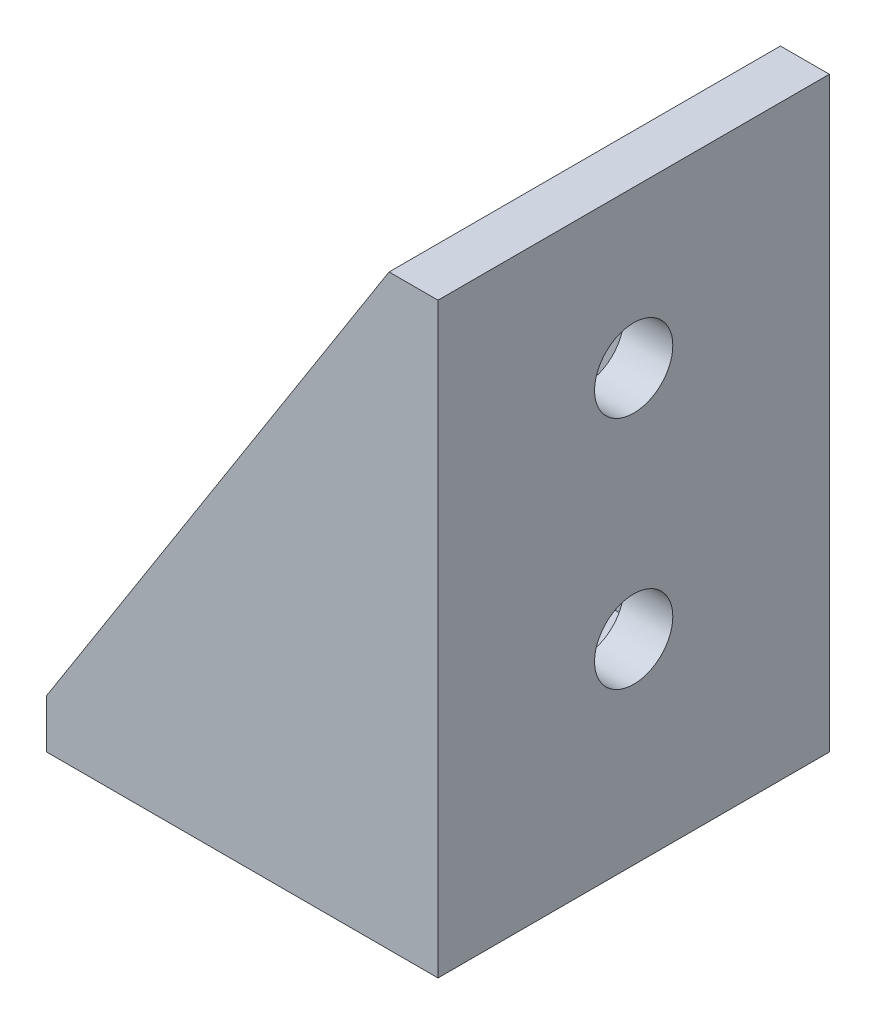
ISO-10303-21;
HEADER;
FILE_DESCRIPTION(('STEP AP214'),'2;1');
FILE_NAME('part.step','',(''),(''),'','','');
FILE_SCHEMA(('AUTOMOTIVE_DESIGN { 1 0 10303 214 1 1 1 1 }'));
ENDSEC;
DATA;
#1=APPLICATION_CONTEXT('core data for automotive mechanical design processes');
#2=APPLICATION_PROTOCOL_DEFINITION('international standard','automotive_design',2000,#1);
#3=PRODUCT_CONTEXT('',#1,'mechanical');
#4=PRODUCT('Part','Part','',(#3));
#5=PRODUCT_RELATED_PRODUCT_CATEGORY('part','',(#4));
#6=PRODUCT_DEFINITION_FORMATION('','',#4);
#7=PRODUCT_DEFINITION_CONTEXT('part definition',#1,'design');
#8=PRODUCT_DEFINITION('design','',#6,#7);
#9=PRODUCT_DEFINITION_SHAPE('','',#8);
#10=(LENGTH_UNIT() NAMED_UNIT(*) SI_UNIT(.MILLI.,.METRE.));
#11=(NAMED_UNIT(*) PLANE_ANGLE_UNIT() SI_UNIT($,.RADIAN.));
#12=(NAMED_UNIT(*) SI_UNIT($,.STERADIAN.) SOLID_ANGLE_UNIT());
#13=UNCERTAINTY_MEASURE_WITH_UNIT(LENGTH_MEASURE(1.E-05),#10,'distance_accuracy_value','');
#14=(GEOMETRIC_REPRESENTATION_CONTEXT(3) GLOBAL_UNCERTAINTY_ASSIGNED_CONTEXT((#13)) GLOBAL_UNIT_ASSIGNED_CONTEXT((#10,
#11,#12)) REPRESENTATION_CONTEXT('',''));
#15=CARTESIAN_POINT('',(0.,0.,0.));
#16=DIRECTION('',(0.,0.,1.));
#17=DIRECTION('',(1.,0.,0.));
#18=AXIS2_PLACEMENT_3D('',#15,#16,#17);
#19=CARTESIAN_POINT('',(17.5,30.,-20.));
#20=DIRECTION('',(-0.843661487732108,0.536875492193159,0.));
#21=DIRECTION('',(-0.536875492193159,-0.843661487732108,0.));
#22=AXIS2_PLACEMENT_3D('',#19,#20,#21);
#23=PLANE('',#22);
#24=DIRECTION('',(0.,0.,1.));
#25=VECTOR('',#24,1.);
#26=CARTESIAN_POINT('',(0.,2.5,-20.));
#27=LINE('',#26,#25);
#28=CARTESIAN_POINT('',(0.,2.5,-20.));
#29=VERTEX_POINT('',#28);
#30=CARTESIAN_POINT('',(0.,2.5,-18.3));
#31=VERTEX_POINT('',#30);
#32=EDGE_CURVE('E58',#29,#31,#27,.T.);
#33=ORIENTED_EDGE('',*,*,#32,.T.);
#34=DIRECTION('',(0.536875492193159,0.843661487732108,0.));
#35=VECTOR('',#34,1.);
#36=CARTESIAN_POINT('',(17.5,30.,-18.3));
#37=LINE('',#36,#35);
#38=CARTESIAN_POINT('',(17.5,30.,-18.3));
#39=VERTEX_POINT('',#38);
#40=EDGE_CURVE('E11',#31,#39,#37,.T.);
#41=ORIENTED_EDGE('',*,*,#40,.T.);
#42=DIRECTION('',(0.,0.,1.));
#43=VECTOR('',#42,1.);
#44=CARTESIAN_POINT('',(17.5,30.,-20.));
#45=LINE('',#44,#43);
#46=CARTESIAN_POINT('',(17.5,30.,-20.));
#47=VERTEX_POINT('',#46);
#48=EDGE_CURVE('E147',#47,#39,#45,.T.);
#49=ORIENTED_EDGE('',*,*,#48,.F.);
#50=DIRECTION('',(-0.536875492193159,-0.843661487732108,0.));
#51=VECTOR('',#50,1.);
#52=CARTESIAN_POINT('',(17.5,30.,-20.));
#53=LINE('',#52,#51);
#54=EDGE_CURVE('E123',#47,#29,#53,.T.);
#55=ORIENTED_EDGE('',*,*,#54,.T.);
#56=EDGE_LOOP('',(#33,#41,#49,#55));
#57=FACE_BOUND('',#56,.T.);
#58=ADVANCED_FACE('F34',(#57),#23,.T.);
#59=CARTESIAN_POINT('',(17.5,30.,-1.7));
#60=VERTEX_POINT('',#59);
#61=CARTESIAN_POINT('',(17.5,30.,0.));
#62=VERTEX_POINT('',#61);
#63=EDGE_CURVE('E115',#60,#62,#45,.T.);
#64=ORIENTED_EDGE('',*,*,#63,.F.);
#65=DIRECTION('',(-0.536875492193159,-0.843661487732108,0.));
#66=VECTOR('',#65,1.);
#67=CARTESIAN_POINT('',(17.5,30.,-1.7));
#68=LINE('',#67,#66);
#69=CARTESIAN_POINT('',(0.,2.5,-1.7));
#70=VERTEX_POINT('',#69);
#71=EDGE_CURVE('E42',#60,#70,#68,.T.);
#72=ORIENTED_EDGE('',*,*,#71,.T.);
#73=CARTESIAN_POINT('',(0.,2.5,0.));
#74=VERTEX_POINT('',#73);
#75=EDGE_CURVE('E84',#70,#74,#27,.T.);
#76=ORIENTED_EDGE('',*,*,#75,.T.);
#77=DIRECTION('',(-0.536875492193159,-0.843661487732108,0.));
#78=VECTOR('',#77,1.);
#79=CARTESIAN_POINT('',(17.5,30.,0.));
#80=LINE('',#79,#78);
#81=EDGE_CURVE('E143',#62,#74,#80,.T.);
#82=ORIENTED_EDGE('',*,*,#81,.F.);
#83=EDGE_LOOP('',(#64,#72,#76,#82));
#84=FACE_BOUND('',#83,.T.);
#85=ADVANCED_FACE('F152',(#84),#23,.T.);
#86=CARTESIAN_POINT('',(0.,2.5,-20.));
#87=DIRECTION('',(-1.,0.,0.));
#88=DIRECTION('',(0.,-1.,0.));
#89=AXIS2_PLACEMENT_3D('',#86,#87,#88);
#90=PLANE('',#89);
#91=DIRECTION('',(0.,-1.,0.));
#92=VECTOR('',#91,1.);
#93=CARTESIAN_POINT('',(0.,2.5,0.));
#94=LINE('',#93,#92);
#95=CARTESIAN_POINT('',(0.,0.,0.));
#96=VERTEX_POINT('',#95);
#97=EDGE_CURVE('E133',#74,#96,#94,.T.);
#98=ORIENTED_EDGE('',*,*,#97,.F.);
#99=ORIENTED_EDGE('',*,*,#75,.F.);
#100=DIRECTION('',(0.,0.,-1.));
#101=VECTOR('',#100,1.);
#102=CARTESIAN_POINT('',(0.,2.5,-20.));
#103=LINE('',#102,#101);
#104=EDGE_CURVE('E159',#70,#31,#103,.T.);
#105=ORIENTED_EDGE('',*,*,#104,.T.);
#106=ORIENTED_EDGE('',*,*,#32,.F.);
#107=DIRECTION('',(0.,-1.,0.));
#108=VECTOR('',#107,1.);
#109=CARTESIAN_POINT('',(0.,2.5,-20.));
#110=LINE('',#109,#108);
#111=CARTESIAN_POINT('',(0.,0.,-20.));
#112=VERTEX_POINT('',#111);
#113=EDGE_CURVE('E128',#29,#112,#110,.T.);
#114=ORIENTED_EDGE('',*,*,#113,.T.);
#115=DIRECTION('',(0.,0.,1.));
#116=VECTOR('',#115,1.);
#117=CARTESIAN_POINT('',(0.,0.,-20.));
#118=LINE('',#117,#116);
#119=EDGE_CURVE('E92',#112,#96,#118,.T.);
#120=ORIENTED_EDGE('',*,*,#119,.T.);
#121=EDGE_LOOP('',(#98,#99,#105,#106,#114,#120));
#122=FACE_BOUND('',#121,.T.);
#123=ADVANCED_FACE('F36',(#122),#90,.T.);
#124=CARTESIAN_POINT('',(20.,30.,-20.));
#125=DIRECTION('',(0.,1.,0.));
#126=DIRECTION('',(0.,0.,1.));
#127=AXIS2_PLACEMENT_3D('',#124,#125,#126);
#128=PLANE('',#127);
#129=DIRECTION('',(-1.,0.,0.));
#130=VECTOR('',#129,1.);
#131=CARTESIAN_POINT('',(20.,30.,0.));
#132=LINE('',#131,#130);
#133=CARTESIAN_POINT('',(20.,30.,0.));
#134=VERTEX_POINT('',#133);
#135=EDGE_CURVE('E110',#134,#62,#132,.T.);
#136=ORIENTED_EDGE('',*,*,#135,.F.);
#137=DIRECTION('',(0.,0.,1.));
#138=VECTOR('',#137,1.);
#139=CARTESIAN_POINT('',(20.,30.,-20.));
#140=LINE('',#139,#138);
#141=CARTESIAN_POINT('',(20.,30.,-20.));
#142=VERTEX_POINT('',#141);
#143=EDGE_CURVE('E103',#142,#134,#140,.T.);
#144=ORIENTED_EDGE('',*,*,#143,.F.);
#145=DIRECTION('',(-1.,0.,0.));
#146=VECTOR('',#145,1.);
#147=CARTESIAN_POINT('',(20.,30.,-20.));
#148=LINE('',#147,#146);
#149=EDGE_CURVE('E107',#142,#47,#148,.T.);
#150=ORIENTED_EDGE('',*,*,#149,.T.);
#151=ORIENTED_EDGE('',*,*,#48,.T.);
#152=DIRECTION('',(0.,0.,1.));
#153=VECTOR('',#152,1.);
#154=CARTESIAN_POINT('',(17.5,30.,-20.));
#155=LINE('',#154,#153);
#156=EDGE_CURVE('E167',#39,#60,#155,.T.);
#157=ORIENTED_EDGE('',*,*,#156,.T.);
#158=ORIENTED_EDGE('',*,*,#63,.T.);
#159=EDGE_LOOP('',(#136,#144,#150,#151,#157,#158));
#160=FACE_BOUND('',#159,.T.);
#161=ADVANCED_FACE('F105',(#160),#128,.T.);
#162=CARTESIAN_POINT('',(20.,0.,-20.));
#163=DIRECTION('',(1.,0.,0.));
#164=DIRECTION('',(0.,0.,-1.));
#165=AXIS2_PLACEMENT_3D('',#162,#163,#164);
#166=PLANE('',#165);
#167=CARTESIAN_POINT('',(20.,22.,-10.));
#168=DIRECTION('',(1.,0.,0.));
#169=DIRECTION('',(0.,0.,-1.));
#170=AXIS2_PLACEMENT_3D('',#167,#168,#169);
#171=CIRCLE('',#170,2.);
#172=CARTESIAN_POINT('',(20.,22.,-12.));
#173=VERTEX_POINT('',#172);
#174=EDGE_CURVE('E185',#173,#173,#171,.F.);
#175=ORIENTED_EDGE('',*,*,#174,.T.);
#176=EDGE_LOOP('',(#175));
#177=FACE_BOUND('',#176,.T.);
#178=CARTESIAN_POINT('',(20.,10.,-10.));
#179=DIRECTION('',(1.,0.,0.));
#180=DIRECTION('',(0.,0.,-1.));
#181=AXIS2_PLACEMENT_3D('',#178,#179,#180);
#182=CIRCLE('',#181,2.);
#183=CARTESIAN_POINT('',(20.,10.,-12.));
#184=VERTEX_POINT('',#183);
#185=EDGE_CURVE('E178',#184,#184,#182,.F.);
#186=ORIENTED_EDGE('',*,*,#185,.T.);
#187=EDGE_LOOP('',(#186));
#188=FACE_BOUND('',#187,.T.);
#189=DIRECTION('',(0.,1.,0.));
#190=VECTOR('',#189,1.);
#191=CARTESIAN_POINT('',(20.,0.,0.));
#192=LINE('',#191,#190);
#193=CARTESIAN_POINT('',(20.,0.,0.));
#194=VERTEX_POINT('',#193);
#195=EDGE_CURVE('E140',#194,#134,#192,.T.);
#196=ORIENTED_EDGE('',*,*,#195,.F.);
#197=DIRECTION('',(0.,0.,1.));
#198=VECTOR('',#197,1.);
#199=CARTESIAN_POINT('',(20.,0.,-20.));
#200=LINE('',#199,#198);
#201=CARTESIAN_POINT('',(20.,0.,-20.));
#202=VERTEX_POINT('',#201);
#203=EDGE_CURVE('E116',#202,#194,#200,.T.);
#204=ORIENTED_EDGE('',*,*,#203,.F.);
#205=DIRECTION('',(0.,1.,0.));
#206=VECTOR('',#205,1.);
#207=CARTESIAN_POINT('',(20.,0.,-20.));
#208=LINE('',#207,#206);
#209=EDGE_CURVE('E121',#202,#142,#208,.T.);
#210=ORIENTED_EDGE('',*,*,#209,.T.);
#211=ORIENTED_EDGE('',*,*,#143,.T.);
#212=EDGE_LOOP('',(#196,#204,#210,#211));
#213=FACE_BOUND('',#212,.T.);
#214=ADVANCED_FACE('F125',(#177,#188,#213),#166,.T.);
#215=CARTESIAN_POINT('',(0.,0.,-20.));
#216=DIRECTION('',(0.,-1.,0.));
#217=DIRECTION('',(0.,0.,-1.));
#218=AXIS2_PLACEMENT_3D('',#215,#216,#217);
#219=PLANE('',#218);
#220=CARTESIAN_POINT('',(9.,0.,-10.));
#221=DIRECTION('',(0.,1.,0.));
#222=DIRECTION('',(0.,0.,1.));
#223=AXIS2_PLACEMENT_3D('',#220,#221,#222);
#224=CIRCLE('',#223,1.7);
#225=CARTESIAN_POINT('',(9.,0.,-8.3));
#226=VERTEX_POINT('',#225);
#227=EDGE_CURVE('E182',#226,#226,#224,.T.);
#228=ORIENTED_EDGE('',*,*,#227,.T.);
#229=EDGE_LOOP('',(#228));
#230=FACE_BOUND('',#229,.T.);
#231=DIRECTION('',(1.,0.,0.));
#232=VECTOR('',#231,1.);
#233=CARTESIAN_POINT('',(0.,0.,0.));
#234=LINE('',#233,#232);
#235=EDGE_CURVE('E136',#96,#194,#234,.T.);
#236=ORIENTED_EDGE('',*,*,#235,.F.);
#237=ORIENTED_EDGE('',*,*,#119,.F.);
#238=DIRECTION('',(1.,0.,0.));
#239=VECTOR('',#238,1.);
#240=CARTESIAN_POINT('',(0.,0.,-20.));
#241=LINE('',#240,#239);
#242=EDGE_CURVE('E126',#112,#202,#241,.T.);
#243=ORIENTED_EDGE('',*,*,#242,.T.);
#244=ORIENTED_EDGE('',*,*,#203,.T.);
#245=EDGE_LOOP('',(#236,#237,#243,#244));
#246=FACE_BOUND('',#245,.T.);
#247=ADVANCED_FACE('F162',(#230,#246),#219,.T.);
#248=CARTESIAN_POINT('',(0.,0.,-20.));
#249=DIRECTION('',(0.,0.,1.));
#250=DIRECTION('',(1.,0.,0.));
#251=AXIS2_PLACEMENT_3D('',#248,#249,#250);
#252=PLANE('',#251);
#253=ORIENTED_EDGE('',*,*,#113,.F.);
#254=ORIENTED_EDGE('',*,*,#54,.F.);
#255=ORIENTED_EDGE('',*,*,#149,.F.);
#256=ORIENTED_EDGE('',*,*,#209,.F.);
#257=ORIENTED_EDGE('',*,*,#242,.F.);
#258=EDGE_LOOP('',(#253,#254,#255,#256,#257));
#259=FACE_BOUND('',#258,.T.);
#260=ADVANCED_FACE('F120',(#259),#252,.F.);
#261=CARTESIAN_POINT('',(0.,0.,0.));
#262=DIRECTION('',(0.,0.,1.));
#263=DIRECTION('',(1.,0.,0.));
#264=AXIS2_PLACEMENT_3D('',#261,#262,#263);
#265=PLANE('',#264);
#266=ORIENTED_EDGE('',*,*,#97,.T.);
#267=ORIENTED_EDGE('',*,*,#235,.T.);
#268=ORIENTED_EDGE('',*,*,#195,.T.);
#269=ORIENTED_EDGE('',*,*,#135,.T.);
#270=ORIENTED_EDGE('',*,*,#81,.T.);
#271=EDGE_LOOP('',(#266,#267,#268,#269,#270));
#272=FACE_BOUND('',#271,.T.);
#273=ADVANCED_FACE('F161',(#272),#265,.T.);
#274=CARTESIAN_POINT('',(20.,2.5,-18.3));
#275=DIRECTION('',(0.,0.,1.));
#276=DIRECTION('',(1.,0.,0.));
#277=AXIS2_PLACEMENT_3D('',#274,#275,#276);
#278=PLANE('',#277);
#279=DIRECTION('',(1.,0.,0.));
#280=VECTOR('',#279,1.);
#281=CARTESIAN_POINT('',(20.,2.5,-18.3));
#282=LINE('',#281,#280);
#283=CARTESIAN_POINT('',(17.5,2.5,-18.3));
#284=VERTEX_POINT('',#283);
#285=EDGE_CURVE('E169',#31,#284,#282,.T.);
#286=ORIENTED_EDGE('',*,*,#285,.T.);
#287=DIRECTION('',(0.,1.,0.));
#288=VECTOR('',#287,1.);
#289=CARTESIAN_POINT('',(17.5,2.5,-18.3));
#290=LINE('',#289,#288);
#291=EDGE_CURVE('E137',#284,#39,#290,.T.);
#292=ORIENTED_EDGE('',*,*,#291,.T.);
#293=ORIENTED_EDGE('',*,*,#40,.F.);
#294=EDGE_LOOP('',(#286,#292,#293));
#295=FACE_BOUND('',#294,.T.);
#296=ADVANCED_FACE('F217',(#295),#278,.T.);
#297=CARTESIAN_POINT('',(17.5,2.5,-20.));
#298=DIRECTION('',(-1.,0.,0.));
#299=DIRECTION('',(0.,0.,1.));
#300=AXIS2_PLACEMENT_3D('',#297,#298,#299);
#301=PLANE('',#300);
#302=CARTESIAN_POINT('',(17.5,22.,-10.));
#303=DIRECTION('',(-1.,0.,0.));
#304=DIRECTION('',(0.,0.,1.));
#305=AXIS2_PLACEMENT_3D('',#302,#303,#304);
#306=CIRCLE('',#305,2.);
#307=CARTESIAN_POINT('',(17.5,22.,-8.));
#308=VERTEX_POINT('',#307);
#309=EDGE_CURVE('E170',#308,#308,#306,.T.);
#310=ORIENTED_EDGE('',*,*,#309,.F.);
#311=EDGE_LOOP('',(#310));
#312=FACE_BOUND('',#311,.T.);
#313=CARTESIAN_POINT('',(17.5,10.,-10.));
#314=DIRECTION('',(-1.,0.,0.));
#315=DIRECTION('',(0.,0.,1.));
#316=AXIS2_PLACEMENT_3D('',#313,#314,#315);
#317=CIRCLE('',#316,2.);
#318=CARTESIAN_POINT('',(17.5,10.,-8.));
#319=VERTEX_POINT('',#318);
#320=EDGE_CURVE('E181',#319,#319,#317,.T.);
#321=ORIENTED_EDGE('',*,*,#320,.F.);
#322=EDGE_LOOP('',(#321));
#323=FACE_BOUND('',#322,.T.);
#324=ORIENTED_EDGE('',*,*,#156,.F.);
#325=ORIENTED_EDGE('',*,*,#291,.F.);
#326=DIRECTION('',(0.,0.,1.));
#327=VECTOR('',#326,1.);
#328=CARTESIAN_POINT('',(17.5,2.5,-20.));
#329=LINE('',#328,#327);
#330=CARTESIAN_POINT('',(17.5,2.5,-1.7));
#331=VERTEX_POINT('',#330);
#332=EDGE_CURVE('E174',#284,#331,#329,.T.);
#333=ORIENTED_EDGE('',*,*,#332,.T.);
#334=DIRECTION('',(0.,1.,0.));
#335=VECTOR('',#334,1.);
#336=CARTESIAN_POINT('',(17.5,2.5,-1.7));
#337=LINE('',#336,#335);
#338=EDGE_CURVE('E49',#331,#60,#337,.T.);
#339=ORIENTED_EDGE('',*,*,#338,.T.);
#340=EDGE_LOOP('',(#324,#325,#333,#339));
#341=FACE_BOUND('',#340,.T.);
#342=ADVANCED_FACE('F219',(#312,#323,#341),#301,.T.);
#343=CARTESIAN_POINT('',(20.,2.5,-1.7));
#344=DIRECTION('',(0.,0.,-1.));
#345=DIRECTION('',(-1.,0.,0.));
#346=AXIS2_PLACEMENT_3D('',#343,#344,#345);
#347=PLANE('',#346);
#348=ORIENTED_EDGE('',*,*,#338,.F.);
#349=DIRECTION('',(-1.,0.,0.));
#350=VECTOR('',#349,1.);
#351=CARTESIAN_POINT('',(20.,2.5,-1.7));
#352=LINE('',#351,#350);
#353=EDGE_CURVE('E172',#331,#70,#352,.T.);
#354=ORIENTED_EDGE('',*,*,#353,.T.);
#355=ORIENTED_EDGE('',*,*,#71,.F.);
#356=EDGE_LOOP('',(#348,#354,#355));
#357=FACE_BOUND('',#356,.T.);
#358=ADVANCED_FACE('F208',(#357),#347,.T.);
#359=CARTESIAN_POINT('',(0.,2.5,0.));
#360=DIRECTION('',(0.,-1.,0.));
#361=DIRECTION('',(0.,0.,-1.));
#362=AXIS2_PLACEMENT_3D('',#359,#360,#361);
#363=PLANE('',#362);
#364=CARTESIAN_POINT('',(9.,2.5,-10.));
#365=DIRECTION('',(0.,-1.,0.));
#366=DIRECTION('',(0.,0.,-1.));
#367=AXIS2_PLACEMENT_3D('',#364,#365,#366);
#368=CIRCLE('',#367,1.7);
#369=CARTESIAN_POINT('',(9.,2.5,-11.7));
#370=VERTEX_POINT('',#369);
#371=EDGE_CURVE('E190',#370,#370,#368,.T.);
#372=ORIENTED_EDGE('',*,*,#371,.T.);
#373=EDGE_LOOP('',(#372));
#374=FACE_BOUND('',#373,.T.);
#375=ORIENTED_EDGE('',*,*,#285,.F.);
#376=ORIENTED_EDGE('',*,*,#104,.F.);
#377=ORIENTED_EDGE('',*,*,#353,.F.);
#378=ORIENTED_EDGE('',*,*,#332,.F.);
#379=EDGE_LOOP('',(#375,#376,#377,#378));
#380=FACE_BOUND('',#379,.T.);
#381=ADVANCED_FACE('F204',(#374,#380),#363,.F.);
#382=CARTESIAN_POINT('',(20.001,10.,-10.));
#383=DIRECTION('',(-1.,0.,0.));
#384=DIRECTION('',(0.,0.,1.));
#385=AXIS2_PLACEMENT_3D('',#382,#383,#384);
#386=CYLINDRICAL_SURFACE('',#385,2.);
#387=ORIENTED_EDGE('',*,*,#185,.F.);
#388=EDGE_LOOP('',(#387));
#389=FACE_BOUND('',#388,.T.);
#390=ORIENTED_EDGE('',*,*,#320,.T.);
#391=EDGE_LOOP('',(#390));
#392=FACE_BOUND('',#391,.T.);
#393=ADVANCED_FACE('F207',(#389,#392),#386,.F.);
#394=CARTESIAN_POINT('',(20.001,22.,-10.));
#395=DIRECTION('',(-1.,0.,0.));
#396=DIRECTION('',(0.,0.,1.));
#397=AXIS2_PLACEMENT_3D('',#394,#395,#396);
#398=CYLINDRICAL_SURFACE('',#397,2.);
#399=ORIENTED_EDGE('',*,*,#174,.F.);
#400=EDGE_LOOP('',(#399));
#401=FACE_BOUND('',#400,.T.);
#402=ORIENTED_EDGE('',*,*,#309,.T.);
#403=EDGE_LOOP('',(#402));
#404=FACE_BOUND('',#403,.T.);
#405=ADVANCED_FACE('F200',(#401,#404),#398,.F.);
#406=CARTESIAN_POINT('',(9.,30.001,-10.));
#407=DIRECTION('',(0.,-1.,0.));
#408=DIRECTION('',(0.,0.,-1.));
#409=AXIS2_PLACEMENT_3D('',#406,#407,#408);
#410=CYLINDRICAL_SURFACE('',#409,1.7);
#411=ORIENTED_EDGE('',*,*,#227,.F.);
#412=EDGE_LOOP('',(#411));
#413=FACE_BOUND('',#412,.T.);
#414=ORIENTED_EDGE('',*,*,#371,.F.);
#415=EDGE_LOOP('',(#414));
#416=FACE_BOUND('',#415,.T.);
#417=ADVANCED_FACE('F197',(#413,#416),#410,.F.);
#418=CLOSED_SHELL('',(#58,#85,#123,#161,#214,#247,#260,#273,#296,#342,#358,#381,#393,#405,#417));
#419=MANIFOLD_SOLID_BREP('B2',#418);
#420=ADVANCED_BREP_SHAPE_REPRESENTATION('',(#18,#419),#14);
#421=SHAPE_DEFINITION_REPRESENTATION(#9,#420);
ENDSEC;
END-ISO-10303-21;
